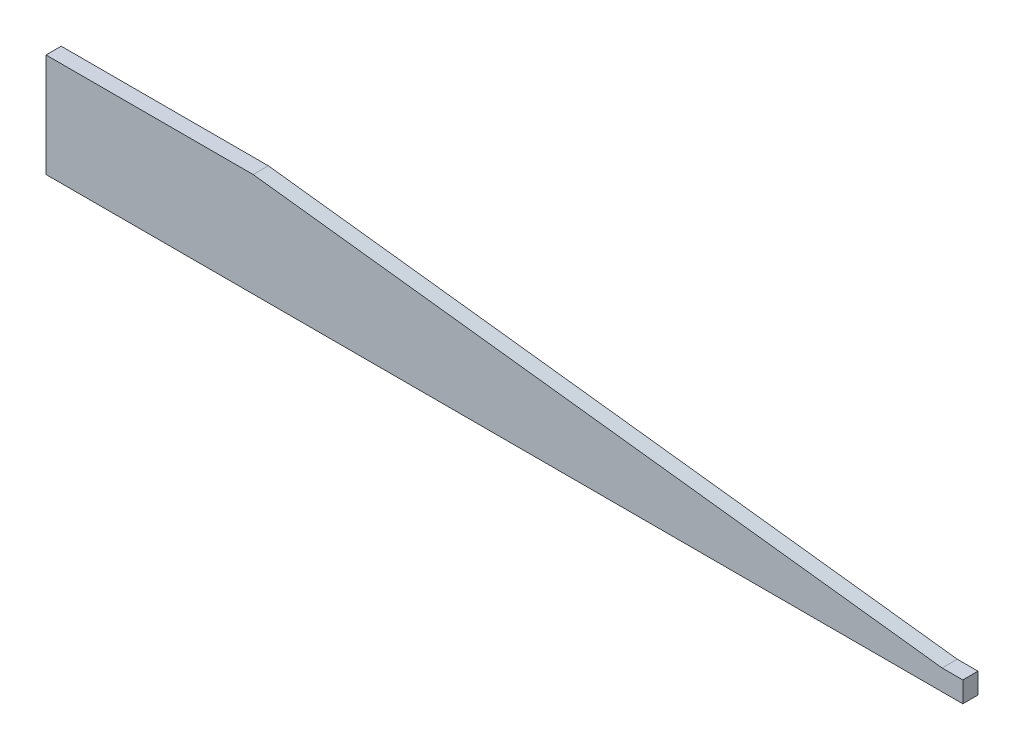
ISO-10303-21;
HEADER;
FILE_DESCRIPTION(('STEP AP214'),'2;1');
FILE_NAME('part.step','',(''),(''),'','','');
FILE_SCHEMA(('AUTOMOTIVE_DESIGN { 1 0 10303 214 1 1 1 1 }'));
ENDSEC;
DATA;
#1=APPLICATION_CONTEXT('core data for automotive mechanical design processes');
#2=APPLICATION_PROTOCOL_DEFINITION('international standard','automotive_design',2000,#1);
#3=PRODUCT_CONTEXT('',#1,'mechanical');
#4=PRODUCT('Part','Part','',(#3));
#5=PRODUCT_RELATED_PRODUCT_CATEGORY('part','',(#4));
#6=PRODUCT_DEFINITION_FORMATION('','',#4);
#7=PRODUCT_DEFINITION_CONTEXT('part definition',#1,'design');
#8=PRODUCT_DEFINITION('design','',#6,#7);
#9=PRODUCT_DEFINITION_SHAPE('','',#8);
#10=(LENGTH_UNIT() NAMED_UNIT(*) SI_UNIT(.MILLI.,.METRE.));
#11=(NAMED_UNIT(*) PLANE_ANGLE_UNIT() SI_UNIT($,.RADIAN.));
#12=(NAMED_UNIT(*) SI_UNIT($,.STERADIAN.) SOLID_ANGLE_UNIT());
#13=UNCERTAINTY_MEASURE_WITH_UNIT(LENGTH_MEASURE(1.E-05),#10,'distance_accuracy_value','');
#14=(GEOMETRIC_REPRESENTATION_CONTEXT(3) GLOBAL_UNCERTAINTY_ASSIGNED_CONTEXT((#13)) GLOBAL_UNIT_ASSIGNED_CONTEXT((#10,
#11,#12)) REPRESENTATION_CONTEXT('',''));
#15=CARTESIAN_POINT('',(0.,0.,0.));
#16=DIRECTION('',(0.,0.,1.));
#17=DIRECTION('',(1.,0.,0.));
#18=AXIS2_PLACEMENT_3D('',#15,#16,#17);
#19=CARTESIAN_POINT('',(664.,-75.,0.));
#20=DIRECTION('',(0.,0.,1.));
#21=DIRECTION('',(1.,0.,0.));
#22=AXIS2_PLACEMENT_3D('',#19,#20,#21);
#23=PLANE('',#22);
#24=DIRECTION('',(1.,0.,0.));
#25=VECTOR('',#24,1.);
#26=CARTESIAN_POINT('',(0.,-150.,0.));
#27=LINE('',#26,#25);
#28=CARTESIAN_POINT('',(0.,-150.,0.));
#29=VERTEX_POINT('',#28);
#30=CARTESIAN_POINT('',(1328.,-150.,0.));
#31=VERTEX_POINT('',#30);
#32=EDGE_CURVE('E103',#29,#31,#27,.T.);
#33=ORIENTED_EDGE('',*,*,#32,.F.);
#34=DIRECTION('',(0.,1.,0.));
#35=VECTOR('',#34,1.);
#36=CARTESIAN_POINT('',(0.,0.,0.));
#37=LINE('',#36,#35);
#38=CARTESIAN_POINT('',(0.,0.,0.));
#39=VERTEX_POINT('',#38);
#40=EDGE_CURVE('E98',#39,#29,#37,.F.);
#41=ORIENTED_EDGE('',*,*,#40,.F.);
#42=DIRECTION('',(1.,0.,0.));
#43=VECTOR('',#42,1.);
#44=CARTESIAN_POINT('',(300.,0.,0.));
#45=LINE('',#44,#43);
#46=CARTESIAN_POINT('',(299.999999999999,0.,0.));
#47=VERTEX_POINT('',#46);
#48=EDGE_CURVE('E92',#47,#39,#45,.F.);
#49=ORIENTED_EDGE('',*,*,#48,.F.);
#50=DIRECTION('',(-0.992848565969376,0.119380589094514,0.));
#51=VECTOR('',#50,1.);
#52=CARTESIAN_POINT('',(1298.,-120.,0.));
#53=LINE('',#52,#51);
#54=CARTESIAN_POINT('',(1298.,-120.,0.));
#55=VERTEX_POINT('',#54);
#56=EDGE_CURVE('E68',#55,#47,#53,.T.);
#57=ORIENTED_EDGE('',*,*,#56,.F.);
#58=DIRECTION('',(-1.,0.,0.));
#59=VECTOR('',#58,1.);
#60=CARTESIAN_POINT('',(1328.,-120.,0.));
#61=LINE('',#60,#59);
#62=CARTESIAN_POINT('',(1328.,-120.,0.));
#63=VERTEX_POINT('',#62);
#64=EDGE_CURVE('E70',#63,#55,#61,.T.);
#65=ORIENTED_EDGE('',*,*,#64,.F.);
#66=DIRECTION('',(0.,1.,0.));
#67=VECTOR('',#66,1.);
#68=CARTESIAN_POINT('',(1328.,-150.,0.));
#69=LINE('',#68,#67);
#70=EDGE_CURVE('E20',#31,#63,#69,.T.);
#71=ORIENTED_EDGE('',*,*,#70,.F.);
#72=EDGE_LOOP('',(#33,#41,#49,#57,#65,#71));
#73=FACE_BOUND('',#72,.T.);
#74=ADVANCED_FACE('F17',(#73),#23,.F.);
#75=CARTESIAN_POINT('',(1328.,-150.,0.));
#76=DIRECTION('',(1.,0.,0.));
#77=DIRECTION('',(0.,0.,-1.));
#78=AXIS2_PLACEMENT_3D('',#75,#76,#77);
#79=PLANE('',#78);
#80=DIRECTION('',(0.,1.,0.));
#81=VECTOR('',#80,1.);
#82=CARTESIAN_POINT('',(1328.,-75.,22.));
#83=LINE('',#82,#81);
#84=CARTESIAN_POINT('',(1328.,-150.,22.));
#85=VERTEX_POINT('',#84);
#86=CARTESIAN_POINT('',(1328.,-120.,22.));
#87=VERTEX_POINT('',#86);
#88=EDGE_CURVE('E107',#85,#87,#83,.T.);
#89=ORIENTED_EDGE('',*,*,#88,.F.);
#90=DIRECTION('',(0.,0.,-1.));
#91=VECTOR('',#90,1.);
#92=CARTESIAN_POINT('',(1328.,-150.,0.));
#93=LINE('',#92,#91);
#94=EDGE_CURVE('E81',#31,#85,#93,.F.);
#95=ORIENTED_EDGE('',*,*,#94,.F.);
#96=ORIENTED_EDGE('',*,*,#70,.T.);
#97=DIRECTION('',(0.,0.,1.));
#98=VECTOR('',#97,1.);
#99=CARTESIAN_POINT('',(1328.,-120.,0.));
#100=LINE('',#99,#98);
#101=EDGE_CURVE('E76',#87,#63,#100,.F.);
#102=ORIENTED_EDGE('',*,*,#101,.F.);
#103=EDGE_LOOP('',(#89,#95,#96,#102));
#104=FACE_BOUND('',#103,.T.);
#105=ADVANCED_FACE('F78',(#104),#79,.T.);
#106=CARTESIAN_POINT('',(1328.,-120.,0.));
#107=DIRECTION('',(0.,1.,0.));
#108=DIRECTION('',(-1.,0.,0.));
#109=AXIS2_PLACEMENT_3D('',#106,#107,#108);
#110=PLANE('',#109);
#111=DIRECTION('',(1.,0.,0.));
#112=VECTOR('',#111,1.);
#113=CARTESIAN_POINT('',(664.,-120.,22.));
#114=LINE('',#113,#112);
#115=CARTESIAN_POINT('',(1298.,-120.,22.));
#116=VERTEX_POINT('',#115);
#117=EDGE_CURVE('E85',#87,#116,#114,.F.);
#118=ORIENTED_EDGE('',*,*,#117,.F.);
#119=ORIENTED_EDGE('',*,*,#101,.T.);
#120=ORIENTED_EDGE('',*,*,#64,.T.);
#121=DIRECTION('',(0.,0.,1.));
#122=VECTOR('',#121,1.);
#123=CARTESIAN_POINT('',(1298.,-120.,0.));
#124=LINE('',#123,#122);
#125=EDGE_CURVE('E88',#116,#55,#124,.F.);
#126=ORIENTED_EDGE('',*,*,#125,.F.);
#127=EDGE_LOOP('',(#118,#119,#120,#126));
#128=FACE_BOUND('',#127,.T.);
#129=ADVANCED_FACE('F83',(#128),#110,.T.);
#130=CARTESIAN_POINT('',(1298.,-120.,0.));
#131=DIRECTION('',(0.119380589094514,0.992848565969376,0.));
#132=DIRECTION('',(-0.992848565969376,0.119380589094514,0.));
#133=AXIS2_PLACEMENT_3D('',#130,#131,#132);
#134=PLANE('',#133);
#135=DIRECTION('',(-0.992848565969376,0.119380589094514,0.));
#136=VECTOR('',#135,1.);
#137=CARTESIAN_POINT('',(1298.,-120.,22.));
#138=LINE('',#137,#136);
#139=CARTESIAN_POINT('',(300.,0.,22.));
#140=VERTEX_POINT('',#139);
#141=EDGE_CURVE('E110',#116,#140,#138,.T.);
#142=ORIENTED_EDGE('',*,*,#141,.F.);
#143=ORIENTED_EDGE('',*,*,#125,.T.);
#144=ORIENTED_EDGE('',*,*,#56,.T.);
#145=DIRECTION('',(0.,0.,1.));
#146=VECTOR('',#145,1.);
#147=CARTESIAN_POINT('',(300.,0.,0.));
#148=LINE('',#147,#146);
#149=EDGE_CURVE('E95',#140,#47,#148,.F.);
#150=ORIENTED_EDGE('',*,*,#149,.F.);
#151=EDGE_LOOP('',(#142,#143,#144,#150));
#152=FACE_BOUND('',#151,.T.);
#153=ADVANCED_FACE('F125',(#152),#134,.T.);
#154=CARTESIAN_POINT('',(300.,0.,0.));
#155=DIRECTION('',(0.,1.,0.));
#156=DIRECTION('',(0.,0.,1.));
#157=AXIS2_PLACEMENT_3D('',#154,#155,#156);
#158=PLANE('',#157);
#159=DIRECTION('',(1.,0.,0.));
#160=VECTOR('',#159,1.);
#161=CARTESIAN_POINT('',(664.,0.,22.));
#162=LINE('',#161,#160);
#163=CARTESIAN_POINT('',(0.,0.,22.));
#164=VERTEX_POINT('',#163);
#165=EDGE_CURVE('E113',#140,#164,#162,.F.);
#166=ORIENTED_EDGE('',*,*,#165,.F.);
#167=ORIENTED_EDGE('',*,*,#149,.T.);
#168=ORIENTED_EDGE('',*,*,#48,.T.);
#169=DIRECTION('',(0.,0.,1.));
#170=VECTOR('',#169,1.);
#171=CARTESIAN_POINT('',(0.,0.,0.));
#172=LINE('',#171,#170);
#173=EDGE_CURVE('E100',#164,#39,#172,.F.);
#174=ORIENTED_EDGE('',*,*,#173,.F.);
#175=EDGE_LOOP('',(#166,#167,#168,#174));
#176=FACE_BOUND('',#175,.T.);
#177=ADVANCED_FACE('F122',(#176),#158,.T.);
#178=CARTESIAN_POINT('',(0.,0.,0.));
#179=DIRECTION('',(-1.,0.,0.));
#180=DIRECTION('',(0.,0.,1.));
#181=AXIS2_PLACEMENT_3D('',#178,#179,#180);
#182=PLANE('',#181);
#183=DIRECTION('',(0.,1.,0.));
#184=VECTOR('',#183,1.);
#185=CARTESIAN_POINT('',(0.,-75.,22.));
#186=LINE('',#185,#184);
#187=CARTESIAN_POINT('',(0.,-150.,22.));
#188=VERTEX_POINT('',#187);
#189=EDGE_CURVE('E26',#164,#188,#186,.F.);
#190=ORIENTED_EDGE('',*,*,#189,.F.);
#191=ORIENTED_EDGE('',*,*,#173,.T.);
#192=ORIENTED_EDGE('',*,*,#40,.T.);
#193=DIRECTION('',(0.,0.,-1.));
#194=VECTOR('',#193,1.);
#195=CARTESIAN_POINT('',(0.,-150.,0.));
#196=LINE('',#195,#194);
#197=EDGE_CURVE('E35',#188,#29,#196,.T.);
#198=ORIENTED_EDGE('',*,*,#197,.F.);
#199=EDGE_LOOP('',(#190,#191,#192,#198));
#200=FACE_BOUND('',#199,.T.);
#201=ADVANCED_FACE('F120',(#200),#182,.T.);
#202=CARTESIAN_POINT('',(0.,-150.,0.));
#203=DIRECTION('',(0.,-1.,0.));
#204=DIRECTION('',(0.,0.,-1.));
#205=AXIS2_PLACEMENT_3D('',#202,#203,#204);
#206=PLANE('',#205);
#207=DIRECTION('',(1.,0.,0.));
#208=VECTOR('',#207,1.);
#209=CARTESIAN_POINT('',(664.,-150.,22.));
#210=LINE('',#209,#208);
#211=EDGE_CURVE('E11',#188,#85,#210,.T.);
#212=ORIENTED_EDGE('',*,*,#211,.F.);
#213=ORIENTED_EDGE('',*,*,#197,.T.);
#214=ORIENTED_EDGE('',*,*,#32,.T.);
#215=ORIENTED_EDGE('',*,*,#94,.T.);
#216=EDGE_LOOP('',(#212,#213,#214,#215));
#217=FACE_BOUND('',#216,.T.);
#218=ADVANCED_FACE('F127',(#217),#206,.T.);
#219=CARTESIAN_POINT('',(664.,-75.,22.));
#220=DIRECTION('',(0.,0.,1.));
#221=DIRECTION('',(1.,0.,0.));
#222=AXIS2_PLACEMENT_3D('',#219,#220,#221);
#223=PLANE('',#222);
#224=ORIENTED_EDGE('',*,*,#189,.T.);
#225=ORIENTED_EDGE('',*,*,#211,.T.);
#226=ORIENTED_EDGE('',*,*,#88,.T.);
#227=ORIENTED_EDGE('',*,*,#117,.T.);
#228=ORIENTED_EDGE('',*,*,#141,.T.);
#229=ORIENTED_EDGE('',*,*,#165,.T.);
#230=EDGE_LOOP('',(#224,#225,#226,#227,#228,#229));
#231=FACE_BOUND('',#230,.T.);
#232=ADVANCED_FACE('F118',(#231),#223,.T.);
#233=CLOSED_SHELL('',(#74,#105,#129,#153,#177,#201,#218,#232));
#234=MANIFOLD_SOLID_BREP('B1',#233);
#235=ADVANCED_BREP_SHAPE_REPRESENTATION('',(#18,#234),#14);
#236=SHAPE_DEFINITION_REPRESENTATION(#9,#235);
ENDSEC;
END-ISO-10303-21;
